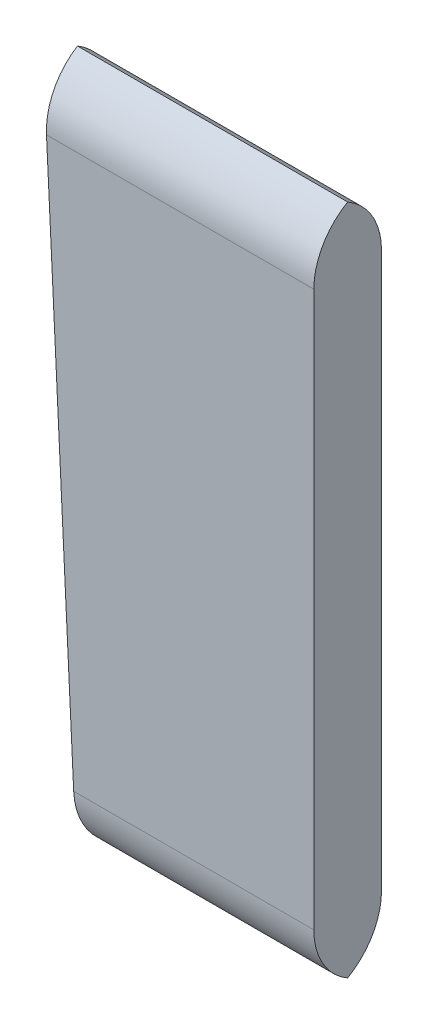
ISO-10303-21;
HEADER;
FILE_DESCRIPTION(('STEP AP214'),'2;1');
FILE_NAME('part.step','',(''),(''),'','','');
FILE_SCHEMA(('AUTOMOTIVE_DESIGN { 1 0 10303 214 1 1 1 1 }'));
ENDSEC;
DATA;
#1=APPLICATION_CONTEXT('core data for automotive mechanical design processes');
#2=APPLICATION_PROTOCOL_DEFINITION('international standard','automotive_design',2000,#1);
#3=PRODUCT_CONTEXT('',#1,'mechanical');
#4=PRODUCT('Part','Part','',(#3));
#5=PRODUCT_RELATED_PRODUCT_CATEGORY('part','',(#4));
#6=PRODUCT_DEFINITION_FORMATION('','',#4);
#7=PRODUCT_DEFINITION_CONTEXT('part definition',#1,'design');
#8=PRODUCT_DEFINITION('design','',#6,#7);
#9=PRODUCT_DEFINITION_SHAPE('','',#8);
#10=(LENGTH_UNIT() NAMED_UNIT(*) SI_UNIT(.MILLI.,.METRE.));
#11=(NAMED_UNIT(*) PLANE_ANGLE_UNIT() SI_UNIT($,.RADIAN.));
#12=(NAMED_UNIT(*) SI_UNIT($,.STERADIAN.) SOLID_ANGLE_UNIT());
#13=UNCERTAINTY_MEASURE_WITH_UNIT(LENGTH_MEASURE(1.E-05),#10,'distance_accuracy_value','');
#14=(GEOMETRIC_REPRESENTATION_CONTEXT(3) GLOBAL_UNCERTAINTY_ASSIGNED_CONTEXT((#13)) GLOBAL_UNIT_ASSIGNED_CONTEXT((#10,
#11,#12)) REPRESENTATION_CONTEXT('',''));
#15=CARTESIAN_POINT('',(0.,0.,0.));
#16=DIRECTION('',(0.,0.,1.));
#17=DIRECTION('',(1.,0.,0.));
#18=AXIS2_PLACEMENT_3D('',#15,#16,#17);
#19=CARTESIAN_POINT('',(-5.98901098901099,-37.8021978021978,10.));
#20=DIRECTION('',(0.998800699959469,0.0489608186254642,0.));
#21=DIRECTION('',(-0.0489608186254642,0.998800699959469,0.));
#22=AXIS2_PLACEMENT_3D('',#19,#20,#21);
#23=PLANE('',#22);
#24=DIRECTION('',(0.0489608186254643,-0.998800699959469,0.));
#25=VECTOR('',#24,1.);
#26=CARTESIAN_POINT('',(-5.98901098901099,-37.8021978021978,0.));
#27=LINE('',#26,#25);
#28=CARTESIAN_POINT('',(-10.4988149105796,54.1978021978022,0.));
#29=VERTEX_POINT('',#28);
#30=CARTESIAN_POINT('',(-6.47920706744236,-27.8021978021978,0.));
#31=VERTEX_POINT('',#30);
#32=EDGE_CURVE('E90',#29,#31,#27,.T.);
#33=ORIENTED_EDGE('',*,*,#32,.T.);
#34=CARTESIAN_POINT('',(-6.47920706744237,-27.8021978021978,10.));
#35=DIRECTION('',(0.998800699959469,0.0489608186254642,0.));
#36=DIRECTION('',(-0.0489608186254642,0.998800699959469,0.));
#37=AXIS2_PLACEMENT_3D('',#34,#35,#36);
#38=ELLIPSE('',#37,10.0120074008817,10.);
#39=CARTESIAN_POINT('',(-6.05468481068529,-36.4624518400422,5.));
#40=VERTEX_POINT('',#39);
#41=EDGE_CURVE('E48',#31,#40,#38,.F.);
#42=ORIENTED_EDGE('',*,*,#41,.T.);
#43=CARTESIAN_POINT('',(-6.47920706744236,-27.8021978021978,0.));
#44=DIRECTION('',(0.998800699959469,0.0489608186254642,0.));
#45=DIRECTION('',(0.0489608186254642,-0.998800699959469,0.));
#46=AXIS2_PLACEMENT_3D('',#43,#44,#45);
#47=ELLIPSE('',#46,10.0120074008817,10.);
#48=CARTESIAN_POINT('',(-6.47920706744236,-27.8021978021978,10.));
#49=VERTEX_POINT('',#48);
#50=EDGE_CURVE('E58',#40,#49,#47,.F.);
#51=ORIENTED_EDGE('',*,*,#50,.T.);
#52=DIRECTION('',(0.0489608186254643,-0.998800699959469,0.));
#53=VECTOR('',#52,1.);
#54=CARTESIAN_POINT('',(-5.98901098901099,-37.8021978021978,10.));
#55=LINE('',#54,#53);
#56=CARTESIAN_POINT('',(-10.4988149105796,54.1978021978022,10.));
#57=VERTEX_POINT('',#56);
#58=EDGE_CURVE('E136',#57,#49,#55,.T.);
#59=ORIENTED_EDGE('',*,*,#58,.F.);
#60=CARTESIAN_POINT('',(-10.4988149105796,54.1978021978022,0.));
#61=DIRECTION('',(0.998800699959469,0.0489608186254642,0.));
#62=DIRECTION('',(-0.0489608186254642,0.998800699959469,0.));
#63=AXIS2_PLACEMENT_3D('',#60,#61,#62);
#64=ELLIPSE('',#63,10.0120074008817,10.);
#65=CARTESIAN_POINT('',(-10.9233371673367,62.8580562356466,5.));
#66=VERTEX_POINT('',#65);
#67=EDGE_CURVE('E92',#57,#66,#64,.F.);
#68=ORIENTED_EDGE('',*,*,#67,.T.);
#69=CARTESIAN_POINT('',(-10.4988149105796,54.1978021978022,10.));
#70=DIRECTION('',(0.998800699959469,0.0489608186254642,0.));
#71=DIRECTION('',(0.0489608186254642,-0.998800699959469,0.));
#72=AXIS2_PLACEMENT_3D('',#69,#70,#71);
#73=ELLIPSE('',#72,10.0120074008817,10.);
#74=EDGE_CURVE('E88',#66,#29,#73,.F.);
#75=ORIENTED_EDGE('',*,*,#74,.T.);
#76=EDGE_LOOP('',(#33,#42,#51,#59,#68,#75));
#77=FACE_BOUND('',#76,.T.);
#78=ADVANCED_FACE('F39',(#77),#23,.F.);
#79=CARTESIAN_POINT('',(29.010989010989,64.1978021978022,10.));
#80=DIRECTION('',(-1.,0.,0.));
#81=DIRECTION('',(0.,-1.,0.));
#82=AXIS2_PLACEMENT_3D('',#79,#80,#81);
#83=PLANE('',#82);
#84=CARTESIAN_POINT('',(29.010989010989,-27.8021978021978,0.));
#85=DIRECTION('',(-1.,0.,0.));
#86=DIRECTION('',(0.,-1.,0.));
#87=AXIS2_PLACEMENT_3D('',#84,#85,#86);
#88=CIRCLE('',#87,10.);
#89=CARTESIAN_POINT('',(29.010989010989,-27.8021978021978,10.));
#90=VERTEX_POINT('',#89);
#91=CARTESIAN_POINT('',(29.010989010989,-36.4624518400422,5.));
#92=VERTEX_POINT('',#91);
#93=EDGE_CURVE('E121',#90,#92,#88,.F.);
#94=ORIENTED_EDGE('',*,*,#93,.T.);
#95=CARTESIAN_POINT('',(29.010989010989,-27.8021978021978,10.));
#96=DIRECTION('',(-1.,0.,0.));
#97=DIRECTION('',(0.,-1.,0.));
#98=AXIS2_PLACEMENT_3D('',#95,#96,#97);
#99=CIRCLE('',#98,10.);
#100=CARTESIAN_POINT('',(29.010989010989,-27.8021978021978,0.));
#101=VERTEX_POINT('',#100);
#102=EDGE_CURVE('E124',#92,#101,#99,.F.);
#103=ORIENTED_EDGE('',*,*,#102,.T.);
#104=DIRECTION('',(0.,1.,0.));
#105=VECTOR('',#104,1.);
#106=CARTESIAN_POINT('',(29.010989010989,64.1978021978022,0.));
#107=LINE('',#106,#105);
#108=CARTESIAN_POINT('',(29.010989010989,54.1978021978022,0.));
#109=VERTEX_POINT('',#108);
#110=EDGE_CURVE('E106',#101,#109,#107,.T.);
#111=ORIENTED_EDGE('',*,*,#110,.T.);
#112=CARTESIAN_POINT('',(29.010989010989,54.1978021978022,10.));
#113=DIRECTION('',(-1.,0.,0.));
#114=DIRECTION('',(0.,-1.,0.));
#115=AXIS2_PLACEMENT_3D('',#112,#113,#114);
#116=CIRCLE('',#115,10.);
#117=CARTESIAN_POINT('',(29.010989010989,62.8580562356466,5.));
#118=VERTEX_POINT('',#117);
#119=EDGE_CURVE('E111',#109,#118,#116,.F.);
#120=ORIENTED_EDGE('',*,*,#119,.T.);
#121=CARTESIAN_POINT('',(29.010989010989,54.1978021978022,0.));
#122=DIRECTION('',(-1.,0.,0.));
#123=DIRECTION('',(0.,-1.,0.));
#124=AXIS2_PLACEMENT_3D('',#121,#122,#123);
#125=CIRCLE('',#124,10.);
#126=CARTESIAN_POINT('',(29.010989010989,54.1978021978022,10.));
#127=VERTEX_POINT('',#126);
#128=EDGE_CURVE('E112',#118,#127,#125,.F.);
#129=ORIENTED_EDGE('',*,*,#128,.T.);
#130=DIRECTION('',(0.,1.,0.));
#131=VECTOR('',#130,1.);
#132=CARTESIAN_POINT('',(29.010989010989,64.1978021978022,10.));
#133=LINE('',#132,#131);
#134=EDGE_CURVE('E143',#90,#127,#133,.T.);
#135=ORIENTED_EDGE('',*,*,#134,.F.);
#136=EDGE_LOOP('',(#94,#103,#111,#120,#129,#135));
#137=FACE_BOUND('',#136,.T.);
#138=ADVANCED_FACE('F130',(#137),#83,.F.);
#139=CARTESIAN_POINT('',(0.,0.,10.));
#140=DIRECTION('',(0.,0.,-1.));
#141=DIRECTION('',(-1.,0.,0.));
#142=AXIS2_PLACEMENT_3D('',#139,#140,#141);
#143=PLANE('',#142);
#144=ORIENTED_EDGE('',*,*,#58,.T.);
#145=DIRECTION('',(1.,0.,0.));
#146=VECTOR('',#145,1.);
#147=CARTESIAN_POINT('',(0.,-27.8021978021978,10.));
#148=LINE('',#147,#146);
#149=EDGE_CURVE('E11',#49,#90,#148,.T.);
#150=ORIENTED_EDGE('',*,*,#149,.T.);
#151=ORIENTED_EDGE('',*,*,#134,.T.);
#152=DIRECTION('',(-1.,0.,0.));
#153=VECTOR('',#152,1.);
#154=CARTESIAN_POINT('',(0.,54.1978021978022,10.));
#155=LINE('',#154,#153);
#156=EDGE_CURVE('E119',#127,#57,#155,.T.);
#157=ORIENTED_EDGE('',*,*,#156,.T.);
#158=EDGE_LOOP('',(#144,#150,#151,#157));
#159=FACE_BOUND('',#158,.T.);
#160=ADVANCED_FACE('F142',(#159),#143,.F.);
#161=CARTESIAN_POINT('',(0.,0.,0.));
#162=DIRECTION('',(0.,0.,-1.));
#163=DIRECTION('',(-1.,0.,0.));
#164=AXIS2_PLACEMENT_3D('',#161,#162,#163);
#165=PLANE('',#164);
#166=ORIENTED_EDGE('',*,*,#110,.F.);
#167=DIRECTION('',(1.,0.,0.));
#168=VECTOR('',#167,1.);
#169=CARTESIAN_POINT('',(-5.98901098901099,-27.8021978021978,0.));
#170=LINE('',#169,#168);
#171=EDGE_CURVE('E105',#101,#31,#170,.F.);
#172=ORIENTED_EDGE('',*,*,#171,.T.);
#173=ORIENTED_EDGE('',*,*,#32,.F.);
#174=DIRECTION('',(-1.,0.,0.));
#175=VECTOR('',#174,1.);
#176=CARTESIAN_POINT('',(29.010989010989,54.1978021978022,0.));
#177=LINE('',#176,#175);
#178=EDGE_CURVE('E97',#29,#109,#177,.F.);
#179=ORIENTED_EDGE('',*,*,#178,.T.);
#180=EDGE_LOOP('',(#166,#172,#173,#179));
#181=FACE_BOUND('',#180,.T.);
#182=ADVANCED_FACE('F103',(#181),#165,.T.);
#183=CARTESIAN_POINT('',(0.,54.1978021978022,0.));
#184=DIRECTION('',(-1.,0.,0.));
#185=DIRECTION('',(0.,0.,1.));
#186=AXIS2_PLACEMENT_3D('',#183,#184,#185);
#187=CYLINDRICAL_SURFACE('',#186,10.);
#188=ORIENTED_EDGE('',*,*,#156,.F.);
#189=ORIENTED_EDGE('',*,*,#128,.F.);
#190=DIRECTION('',(-1.,0.,0.));
#191=VECTOR('',#190,1.);
#192=CARTESIAN_POINT('',(8.890989010989,62.8580562356466,5.));
#193=LINE('',#192,#191);
#194=EDGE_CURVE('E107',#66,#118,#193,.F.);
#195=ORIENTED_EDGE('',*,*,#194,.F.);
#196=ORIENTED_EDGE('',*,*,#67,.F.);
#197=EDGE_LOOP('',(#188,#189,#195,#196));
#198=FACE_BOUND('',#197,.T.);
#199=ADVANCED_FACE('F149',(#198),#187,.T.);
#200=CARTESIAN_POINT('',(-10.989010989011,54.1978021978022,10.));
#201=DIRECTION('',(1.,0.,0.));
#202=DIRECTION('',(0.,0.,-1.));
#203=AXIS2_PLACEMENT_3D('',#200,#201,#202);
#204=CYLINDRICAL_SURFACE('',#203,10.);
#205=ORIENTED_EDGE('',*,*,#119,.F.);
#206=ORIENTED_EDGE('',*,*,#178,.F.);
#207=ORIENTED_EDGE('',*,*,#74,.F.);
#208=ORIENTED_EDGE('',*,*,#194,.T.);
#209=EDGE_LOOP('',(#205,#206,#207,#208));
#210=FACE_BOUND('',#209,.T.);
#211=ADVANCED_FACE('F110',(#210),#204,.T.);
#212=CARTESIAN_POINT('',(0.,-27.8021978021978,0.));
#213=DIRECTION('',(1.,0.,0.));
#214=DIRECTION('',(0.,1.,0.));
#215=AXIS2_PLACEMENT_3D('',#212,#213,#214);
#216=CYLINDRICAL_SURFACE('',#215,10.);
#217=ORIENTED_EDGE('',*,*,#149,.F.);
#218=ORIENTED_EDGE('',*,*,#50,.F.);
#219=DIRECTION('',(1.,0.,0.));
#220=VECTOR('',#219,1.);
#221=CARTESIAN_POINT('',(11.159420383538,-36.4624518400422,5.));
#222=LINE('',#221,#220);
#223=EDGE_CURVE('E43',#92,#40,#222,.F.);
#224=ORIENTED_EDGE('',*,*,#223,.F.);
#225=ORIENTED_EDGE('',*,*,#93,.F.);
#226=EDGE_LOOP('',(#217,#218,#224,#225));
#227=FACE_BOUND('',#226,.T.);
#228=ADVANCED_FACE('F41',(#227),#216,.T.);
#229=CARTESIAN_POINT('',(29.010989010989,-27.8021978021978,10.));
#230=DIRECTION('',(-1.,0.,0.));
#231=DIRECTION('',(0.,-1.,0.));
#232=AXIS2_PLACEMENT_3D('',#229,#230,#231);
#233=CYLINDRICAL_SURFACE('',#232,10.);
#234=ORIENTED_EDGE('',*,*,#41,.F.);
#235=ORIENTED_EDGE('',*,*,#171,.F.);
#236=ORIENTED_EDGE('',*,*,#102,.F.);
#237=ORIENTED_EDGE('',*,*,#223,.T.);
#238=EDGE_LOOP('',(#234,#235,#236,#237));
#239=FACE_BOUND('',#238,.T.);
#240=ADVANCED_FACE('F138',(#239),#233,.T.);
#241=CLOSED_SHELL('',(#78,#138,#160,#182,#199,#211,#228,#240));
#242=MANIFOLD_SOLID_BREP('B2',#241);
#243=ADVANCED_BREP_SHAPE_REPRESENTATION('',(#18,#242),#14);
#244=SHAPE_DEFINITION_REPRESENTATION(#9,#243);
ENDSEC;
END-ISO-10303-21;
